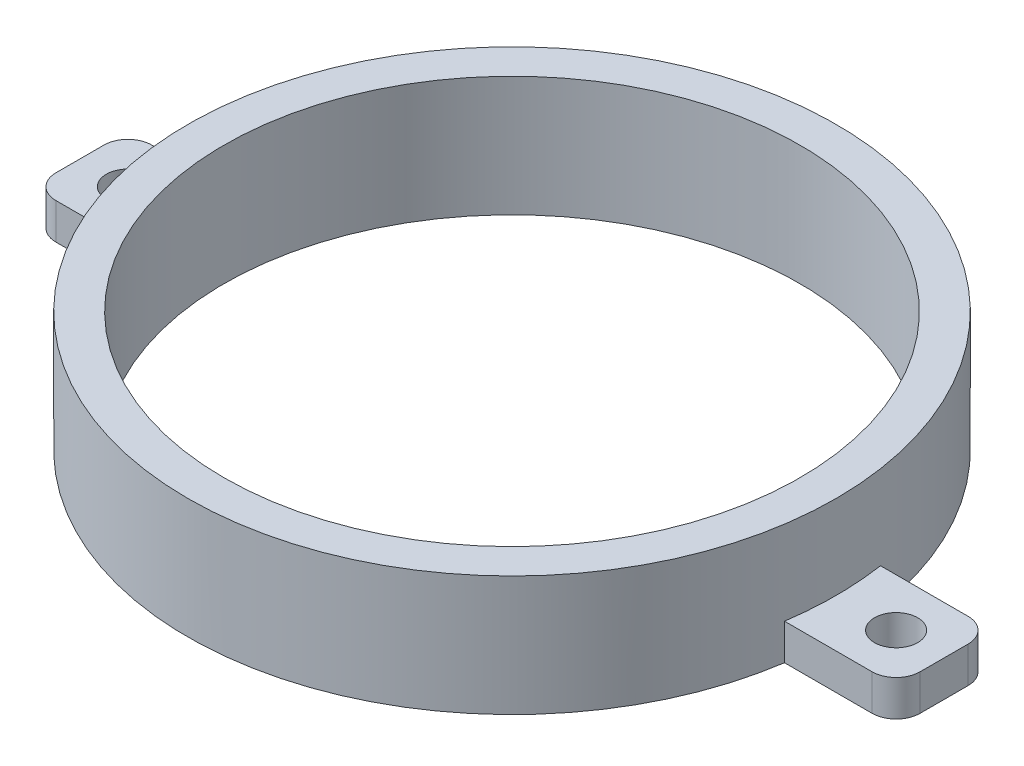
ISO-10303-21;
HEADER;
FILE_DESCRIPTION(('STEP AP214'),'2;1');
FILE_NAME('part.step','',(''),(''),'','','');
FILE_SCHEMA(('AUTOMOTIVE_DESIGN { 1 0 10303 214 1 1 1 1 }'));
ENDSEC;
DATA;
#1=APPLICATION_CONTEXT('core data for automotive mechanical design processes');
#2=APPLICATION_PROTOCOL_DEFINITION('international standard','automotive_design',2000,#1);
#3=PRODUCT_CONTEXT('',#1,'mechanical');
#4=PRODUCT('Part','Part','',(#3));
#5=PRODUCT_RELATED_PRODUCT_CATEGORY('part','',(#4));
#6=PRODUCT_DEFINITION_FORMATION('','',#4);
#7=PRODUCT_DEFINITION_CONTEXT('part definition',#1,'design');
#8=PRODUCT_DEFINITION('design','',#6,#7);
#9=PRODUCT_DEFINITION_SHAPE('','',#8);
#10=(LENGTH_UNIT() NAMED_UNIT(*) SI_UNIT(.MILLI.,.METRE.));
#11=(NAMED_UNIT(*) PLANE_ANGLE_UNIT() SI_UNIT($,.RADIAN.));
#12=(NAMED_UNIT(*) SI_UNIT($,.STERADIAN.) SOLID_ANGLE_UNIT());
#13=UNCERTAINTY_MEASURE_WITH_UNIT(LENGTH_MEASURE(1.E-05),#10,'distance_accuracy_value','');
#14=(GEOMETRIC_REPRESENTATION_CONTEXT(3) GLOBAL_UNCERTAINTY_ASSIGNED_CONTEXT((#13)) GLOBAL_UNIT_ASSIGNED_CONTEXT((#10,
#11,#12)) REPRESENTATION_CONTEXT('',''));
#15=CARTESIAN_POINT('',(0.,0.,0.));
#16=DIRECTION('',(0.,0.,1.));
#17=DIRECTION('',(1.,0.,0.));
#18=AXIS2_PLACEMENT_3D('',#15,#16,#17);
#19=CARTESIAN_POINT('',(0.,10.,0.));
#20=DIRECTION('',(0.,-1.,0.));
#21=DIRECTION('',(0.,0.,-1.));
#22=AXIS2_PLACEMENT_3D('',#19,#20,#21);
#23=CYLINDRICAL_SURFACE('',#22,27.);
#24=CARTESIAN_POINT('',(0.,0.,0.));
#25=DIRECTION('',(0.,1.,0.));
#26=DIRECTION('',(0.,0.,1.));
#27=AXIS2_PLACEMENT_3D('',#24,#25,#26);
#28=CIRCLE('',#27,27.);
#29=CARTESIAN_POINT('',(-26.7020598456374,0.,4.));
#30=VERTEX_POINT('',#29);
#31=CARTESIAN_POINT('',(26.7020598456374,0.,4.));
#32=VERTEX_POINT('',#31);
#33=EDGE_CURVE('E226',#30,#32,#28,.T.);
#34=ORIENTED_EDGE('',*,*,#33,.T.);
#35=DIRECTION('',(0.,-1.,0.));
#36=VECTOR('',#35,1.);
#37=CARTESIAN_POINT('',(26.7020598456374,10.,4.));
#38=LINE('',#37,#36);
#39=CARTESIAN_POINT('',(26.7020598456374,3.,4.));
#40=VERTEX_POINT('',#39);
#41=EDGE_CURVE('E47',#32,#40,#38,.F.);
#42=ORIENTED_EDGE('',*,*,#41,.T.);
#43=CARTESIAN_POINT('',(0.,3.,0.));
#44=DIRECTION('',(0.,-1.,0.));
#45=DIRECTION('',(0.,0.,-1.));
#46=AXIS2_PLACEMENT_3D('',#43,#44,#45);
#47=CIRCLE('',#46,27.);
#48=CARTESIAN_POINT('',(26.7020598456374,3.,-4.));
#49=VERTEX_POINT('',#48);
#50=EDGE_CURVE('E51',#49,#40,#47,.T.);
#51=ORIENTED_EDGE('',*,*,#50,.F.);
#52=DIRECTION('',(0.,-1.,0.));
#53=VECTOR('',#52,1.);
#54=CARTESIAN_POINT('',(26.7020598456374,10.,-4.));
#55=LINE('',#54,#53);
#56=CARTESIAN_POINT('',(26.7020598456374,0.,-4.));
#57=VERTEX_POINT('',#56);
#58=EDGE_CURVE('E170',#49,#57,#55,.T.);
#59=ORIENTED_EDGE('',*,*,#58,.T.);
#60=CARTESIAN_POINT('',(-26.7020598456374,0.,-4.));
#61=VERTEX_POINT('',#60);
#62=EDGE_CURVE('E220',#57,#61,#28,.T.);
#63=ORIENTED_EDGE('',*,*,#62,.T.);
#64=DIRECTION('',(0.,-1.,0.));
#65=VECTOR('',#64,1.);
#66=CARTESIAN_POINT('',(-26.7020598456374,10.,-4.));
#67=LINE('',#66,#65);
#68=CARTESIAN_POINT('',(-26.7020598456374,3.,-4.));
#69=VERTEX_POINT('',#68);
#70=EDGE_CURVE('E11',#69,#61,#67,.T.);
#71=ORIENTED_EDGE('',*,*,#70,.F.);
#72=CARTESIAN_POINT('',(0.,3.,0.));
#73=DIRECTION('',(0.,-1.,0.));
#74=DIRECTION('',(0.,0.,-1.));
#75=AXIS2_PLACEMENT_3D('',#72,#73,#74);
#76=CIRCLE('',#75,27.);
#77=CARTESIAN_POINT('',(-26.7020598456374,3.,4.));
#78=VERTEX_POINT('',#77);
#79=EDGE_CURVE('E213',#78,#69,#76,.T.);
#80=ORIENTED_EDGE('',*,*,#79,.F.);
#81=DIRECTION('',(0.,-1.,0.));
#82=VECTOR('',#81,1.);
#83=CARTESIAN_POINT('',(-26.7020598456374,10.,4.));
#84=LINE('',#83,#82);
#85=EDGE_CURVE('E40',#30,#78,#84,.F.);
#86=ORIENTED_EDGE('',*,*,#85,.F.);
#87=EDGE_LOOP('',(#34,#42,#51,#59,#63,#71,#80,#86));
#88=FACE_BOUND('',#87,.T.);
#89=CARTESIAN_POINT('',(0.,10.,0.));
#90=DIRECTION('',(0.,1.,0.));
#91=DIRECTION('',(0.,0.,1.));
#92=AXIS2_PLACEMENT_3D('',#89,#90,#91);
#93=CIRCLE('',#92,27.);
#94=CARTESIAN_POINT('',(0.,10.,27.));
#95=VERTEX_POINT('',#94);
#96=EDGE_CURVE('E223',#95,#95,#93,.T.);
#97=ORIENTED_EDGE('',*,*,#96,.F.);
#98=EDGE_LOOP('',(#97));
#99=FACE_BOUND('',#98,.T.);
#100=ADVANCED_FACE('F33',(#88,#99),#23,.T.);
#101=CARTESIAN_POINT('',(0.,10.,0.));
#102=DIRECTION('',(0.,1.,0.));
#103=DIRECTION('',(0.,0.,1.));
#104=AXIS2_PLACEMENT_3D('',#101,#102,#103);
#105=PLANE('',#104);
#106=ORIENTED_EDGE('',*,*,#96,.T.);
#107=EDGE_LOOP('',(#106));
#108=FACE_BOUND('',#107,.T.);
#109=CARTESIAN_POINT('',(0.,10.,0.));
#110=DIRECTION('',(0.,1.,0.));
#111=DIRECTION('',(0.,0.,1.));
#112=AXIS2_PLACEMENT_3D('',#109,#110,#111);
#113=CIRCLE('',#112,24.);
#114=CARTESIAN_POINT('',(0.,10.,24.));
#115=VERTEX_POINT('',#114);
#116=EDGE_CURVE('E217',#115,#115,#113,.T.);
#117=ORIENTED_EDGE('',*,*,#116,.F.);
#118=EDGE_LOOP('',(#117));
#119=FACE_BOUND('',#118,.T.);
#120=ADVANCED_FACE('F250',(#108,#119),#105,.T.);
#121=CARTESIAN_POINT('',(0.,0.,0.));
#122=DIRECTION('',(0.,1.,0.));
#123=DIRECTION('',(0.,0.,1.));
#124=AXIS2_PLACEMENT_3D('',#121,#122,#123);
#125=PLANE('',#124);
#126=ORIENTED_EDGE('',*,*,#62,.F.);
#127=DIRECTION('',(1.,0.,0.));
#128=VECTOR('',#127,1.);
#129=CARTESIAN_POINT('',(24.,0.,-4.));
#130=LINE('',#129,#128);
#131=CARTESIAN_POINT('',(34.,0.,-3.99999999999999));
#132=VERTEX_POINT('',#131);
#133=EDGE_CURVE('E139',#57,#132,#130,.T.);
#134=ORIENTED_EDGE('',*,*,#133,.T.);
#135=CARTESIAN_POINT('',(34.,0.,-2.));
#136=DIRECTION('',(0.,-1.,0.));
#137=DIRECTION('',(0.,0.,-1.));
#138=AXIS2_PLACEMENT_3D('',#135,#136,#137);
#139=CIRCLE('',#138,2.);
#140=CARTESIAN_POINT('',(36.,0.,-1.99999999999998));
#141=VERTEX_POINT('',#140);
#142=EDGE_CURVE('E160',#132,#141,#139,.T.);
#143=ORIENTED_EDGE('',*,*,#142,.T.);
#144=DIRECTION('',(0.,0.,1.));
#145=VECTOR('',#144,1.);
#146=CARTESIAN_POINT('',(36.,0.,-1.99999999999998));
#147=LINE('',#146,#145);
#148=CARTESIAN_POINT('',(36.,0.,1.99999999999999));
#149=VERTEX_POINT('',#148);
#150=EDGE_CURVE('E157',#141,#149,#147,.T.);
#151=ORIENTED_EDGE('',*,*,#150,.T.);
#152=CARTESIAN_POINT('',(34.,0.,2.));
#153=DIRECTION('',(0.,-1.,0.));
#154=DIRECTION('',(0.,0.,-1.));
#155=AXIS2_PLACEMENT_3D('',#152,#153,#154);
#156=CIRCLE('',#155,2.);
#157=CARTESIAN_POINT('',(34.,0.,4.00000000000001));
#158=VERTEX_POINT('',#157);
#159=EDGE_CURVE('E154',#149,#158,#156,.T.);
#160=ORIENTED_EDGE('',*,*,#159,.T.);
#161=DIRECTION('',(-1.,0.,0.));
#162=VECTOR('',#161,1.);
#163=CARTESIAN_POINT('',(34.,0.,4.));
#164=LINE('',#163,#162);
#165=EDGE_CURVE('E125',#158,#32,#164,.T.);
#166=ORIENTED_EDGE('',*,*,#165,.T.);
#167=ORIENTED_EDGE('',*,*,#33,.F.);
#168=DIRECTION('',(1.,0.,0.));
#169=VECTOR('',#168,1.);
#170=CARTESIAN_POINT('',(-34.,0.,4.));
#171=LINE('',#170,#169);
#172=CARTESIAN_POINT('',(-34.,0.,4.00000000000001));
#173=VERTEX_POINT('',#172);
#174=EDGE_CURVE('E183',#173,#30,#171,.T.);
#175=ORIENTED_EDGE('',*,*,#174,.F.);
#176=CARTESIAN_POINT('',(-34.,0.,2.));
#177=DIRECTION('',(0.,1.,0.));
#178=DIRECTION('',(0.,0.,-1.));
#179=AXIS2_PLACEMENT_3D('',#176,#177,#178);
#180=CIRCLE('',#179,2.);
#181=CARTESIAN_POINT('',(-36.,0.,1.99999999999999));
#182=VERTEX_POINT('',#181);
#183=EDGE_CURVE('E198',#182,#173,#180,.T.);
#184=ORIENTED_EDGE('',*,*,#183,.F.);
#185=DIRECTION('',(0.,0.,1.));
#186=VECTOR('',#185,1.);
#187=CARTESIAN_POINT('',(-36.,0.,-1.99999999999998));
#188=LINE('',#187,#186);
#189=CARTESIAN_POINT('',(-36.,0.,-1.99999999999998));
#190=VERTEX_POINT('',#189);
#191=EDGE_CURVE('E196',#190,#182,#188,.T.);
#192=ORIENTED_EDGE('',*,*,#191,.F.);
#193=CARTESIAN_POINT('',(-34.,0.,-2.));
#194=DIRECTION('',(0.,1.,0.));
#195=DIRECTION('',(0.,0.,-1.));
#196=AXIS2_PLACEMENT_3D('',#193,#194,#195);
#197=CIRCLE('',#196,2.);
#198=CARTESIAN_POINT('',(-34.,0.,-3.99999999999999));
#199=VERTEX_POINT('',#198);
#200=EDGE_CURVE('E194',#199,#190,#197,.T.);
#201=ORIENTED_EDGE('',*,*,#200,.F.);
#202=DIRECTION('',(-1.,0.,0.));
#203=VECTOR('',#202,1.);
#204=CARTESIAN_POINT('',(-24.,0.,-4.));
#205=LINE('',#204,#203);
#206=EDGE_CURVE('E177',#61,#199,#205,.T.);
#207=ORIENTED_EDGE('',*,*,#206,.F.);
#208=EDGE_LOOP('',(#126,#134,#143,#151,#160,#166,#167,#175,#184,#192,#201,#207));
#209=FACE_BOUND('',#208,.T.);
#210=CARTESIAN_POINT('',(0.,0.,0.));
#211=DIRECTION('',(0.,1.,0.));
#212=DIRECTION('',(0.,0.,1.));
#213=AXIS2_PLACEMENT_3D('',#210,#211,#212);
#214=CIRCLE('',#213,24.);
#215=CARTESIAN_POINT('',(0.,0.,24.));
#216=VERTEX_POINT('',#215);
#217=EDGE_CURVE('E216',#216,#216,#214,.T.);
#218=ORIENTED_EDGE('',*,*,#217,.T.);
#219=EDGE_LOOP('',(#218));
#220=FACE_BOUND('',#219,.T.);
#221=CARTESIAN_POINT('',(-32.,0.,0.));
#222=DIRECTION('',(0.,1.,0.));
#223=DIRECTION('',(0.,0.,1.));
#224=AXIS2_PLACEMENT_3D('',#221,#222,#223);
#225=CIRCLE('',#224,1.8);
#226=CARTESIAN_POINT('',(-32.,0.,1.8));
#227=VERTEX_POINT('',#226);
#228=EDGE_CURVE('E173',#227,#227,#225,.T.);
#229=ORIENTED_EDGE('',*,*,#228,.T.);
#230=EDGE_LOOP('',(#229));
#231=FACE_BOUND('',#230,.T.);
#232=CARTESIAN_POINT('',(32.,0.,0.));
#233=DIRECTION('',(0.,-1.,0.));
#234=DIRECTION('',(0.,0.,1.));
#235=AXIS2_PLACEMENT_3D('',#232,#233,#234);
#236=CIRCLE('',#235,1.8);
#237=CARTESIAN_POINT('',(32.,0.,1.8));
#238=VERTEX_POINT('',#237);
#239=EDGE_CURVE('E318',#238,#238,#236,.T.);
#240=ORIENTED_EDGE('',*,*,#239,.F.);
#241=EDGE_LOOP('',(#240));
#242=FACE_BOUND('',#241,.T.);
#243=ADVANCED_FACE('F245',(#209,#220,#231,#242),#125,.F.);
#244=CARTESIAN_POINT('',(0.,10.,0.));
#245=DIRECTION('',(0.,-1.,0.));
#246=DIRECTION('',(0.,0.,-1.));
#247=AXIS2_PLACEMENT_3D('',#244,#245,#246);
#248=CYLINDRICAL_SURFACE('',#247,24.);
#249=ORIENTED_EDGE('',*,*,#217,.F.);
#250=EDGE_LOOP('',(#249));
#251=FACE_BOUND('',#250,.T.);
#252=ORIENTED_EDGE('',*,*,#116,.T.);
#253=EDGE_LOOP('',(#252));
#254=FACE_BOUND('',#253,.T.);
#255=ADVANCED_FACE('F258',(#251,#254),#248,.F.);
#256=CARTESIAN_POINT('',(-24.,3.,-4.));
#257=DIRECTION('',(0.,0.,1.));
#258=DIRECTION('',(1.,0.,0.));
#259=AXIS2_PLACEMENT_3D('',#256,#257,#258);
#260=PLANE('',#259);
#261=DIRECTION('',(-1.,0.,0.));
#262=VECTOR('',#261,1.);
#263=CARTESIAN_POINT('',(-24.,3.,-4.));
#264=LINE('',#263,#262);
#265=CARTESIAN_POINT('',(-34.,3.,-3.99999999999999));
#266=VERTEX_POINT('',#265);
#267=EDGE_CURVE('E180',#69,#266,#264,.T.);
#268=ORIENTED_EDGE('',*,*,#267,.F.);
#269=ORIENTED_EDGE('',*,*,#70,.T.);
#270=ORIENTED_EDGE('',*,*,#206,.T.);
#271=DIRECTION('',(0.,-1.,0.));
#272=VECTOR('',#271,1.);
#273=CARTESIAN_POINT('',(-34.,3.,-3.99999999999999));
#274=LINE('',#273,#272);
#275=EDGE_CURVE('E210',#266,#199,#274,.T.);
#276=ORIENTED_EDGE('',*,*,#275,.F.);
#277=EDGE_LOOP('',(#268,#269,#270,#276));
#278=FACE_BOUND('',#277,.T.);
#279=ADVANCED_FACE('F260',(#278),#260,.F.);
#280=CARTESIAN_POINT('',(-34.,3.,4.));
#281=DIRECTION('',(0.,0.,-1.));
#282=DIRECTION('',(-1.,0.,0.));
#283=AXIS2_PLACEMENT_3D('',#280,#281,#282);
#284=PLANE('',#283);
#285=ORIENTED_EDGE('',*,*,#174,.T.);
#286=ORIENTED_EDGE('',*,*,#85,.T.);
#287=DIRECTION('',(1.,0.,0.));
#288=VECTOR('',#287,1.);
#289=CARTESIAN_POINT('',(-34.,3.,4.));
#290=LINE('',#289,#288);
#291=CARTESIAN_POINT('',(-34.,3.,4.00000000000001));
#292=VERTEX_POINT('',#291);
#293=EDGE_CURVE('E189',#292,#78,#290,.T.);
#294=ORIENTED_EDGE('',*,*,#293,.F.);
#295=DIRECTION('',(0.,-1.,0.));
#296=VECTOR('',#295,1.);
#297=CARTESIAN_POINT('',(-34.,3.,4.00000000000001));
#298=LINE('',#297,#296);
#299=EDGE_CURVE('E192',#292,#173,#298,.T.);
#300=ORIENTED_EDGE('',*,*,#299,.T.);
#301=EDGE_LOOP('',(#285,#286,#294,#300));
#302=FACE_BOUND('',#301,.T.);
#303=ADVANCED_FACE('F230',(#302),#284,.F.);
#304=CARTESIAN_POINT('',(-34.,3.,-2.));
#305=DIRECTION('',(0.,-1.,0.));
#306=DIRECTION('',(0.,0.,-1.));
#307=AXIS2_PLACEMENT_3D('',#304,#305,#306);
#308=PLANE('',#307);
#309=ORIENTED_EDGE('',*,*,#293,.T.);
#310=ORIENTED_EDGE('',*,*,#79,.T.);
#311=ORIENTED_EDGE('',*,*,#267,.T.);
#312=CARTESIAN_POINT('',(-34.,3.,-2.));
#313=DIRECTION('',(0.,1.,0.));
#314=DIRECTION('',(0.,0.,-1.));
#315=AXIS2_PLACEMENT_3D('',#312,#313,#314);
#316=CIRCLE('',#315,2.);
#317=CARTESIAN_POINT('',(-36.,3.,-1.99999999999998));
#318=VERTEX_POINT('',#317);
#319=EDGE_CURVE('E182',#266,#318,#316,.T.);
#320=ORIENTED_EDGE('',*,*,#319,.T.);
#321=DIRECTION('',(0.,0.,1.));
#322=VECTOR('',#321,1.);
#323=CARTESIAN_POINT('',(-36.,3.,-1.99999999999998));
#324=LINE('',#323,#322);
#325=CARTESIAN_POINT('',(-36.,3.,1.99999999999999));
#326=VERTEX_POINT('',#325);
#327=EDGE_CURVE('E185',#318,#326,#324,.T.);
#328=ORIENTED_EDGE('',*,*,#327,.T.);
#329=CARTESIAN_POINT('',(-34.,3.,2.));
#330=DIRECTION('',(0.,1.,0.));
#331=DIRECTION('',(0.,0.,-1.));
#332=AXIS2_PLACEMENT_3D('',#329,#330,#331);
#333=CIRCLE('',#332,2.);
#334=EDGE_CURVE('E187',#326,#292,#333,.T.);
#335=ORIENTED_EDGE('',*,*,#334,.T.);
#336=EDGE_LOOP('',(#309,#310,#311,#320,#328,#335));
#337=FACE_BOUND('',#336,.T.);
#338=CARTESIAN_POINT('',(-32.,3.,0.));
#339=DIRECTION('',(0.,1.,0.));
#340=DIRECTION('',(0.,0.,1.));
#341=AXIS2_PLACEMENT_3D('',#338,#339,#340);
#342=CIRCLE('',#341,1.8);
#343=CARTESIAN_POINT('',(-32.,3.,1.8));
#344=VERTEX_POINT('',#343);
#345=EDGE_CURVE('E174',#344,#344,#342,.T.);
#346=ORIENTED_EDGE('',*,*,#345,.F.);
#347=EDGE_LOOP('',(#346));
#348=FACE_BOUND('',#347,.T.);
#349=ADVANCED_FACE('F234',(#337,#348),#308,.F.);
#350=CARTESIAN_POINT('',(-34.,3.,-2.));
#351=DIRECTION('',(0.,-1.,0.));
#352=DIRECTION('',(0.,0.,-1.));
#353=AXIS2_PLACEMENT_3D('',#350,#351,#352);
#354=CYLINDRICAL_SURFACE('',#353,2.);
#355=ORIENTED_EDGE('',*,*,#200,.T.);
#356=DIRECTION('',(0.,-1.,0.));
#357=VECTOR('',#356,1.);
#358=CARTESIAN_POINT('',(-36.,3.,-1.99999999999998));
#359=LINE('',#358,#357);
#360=EDGE_CURVE('E207',#318,#190,#359,.T.);
#361=ORIENTED_EDGE('',*,*,#360,.F.);
#362=ORIENTED_EDGE('',*,*,#319,.F.);
#363=ORIENTED_EDGE('',*,*,#275,.T.);
#364=EDGE_LOOP('',(#355,#361,#362,#363));
#365=FACE_BOUND('',#364,.T.);
#366=ADVANCED_FACE('F271',(#365),#354,.T.);
#367=CARTESIAN_POINT('',(-36.,3.,-1.99999999999998));
#368=DIRECTION('',(1.,0.,0.));
#369=DIRECTION('',(0.,0.,-1.));
#370=AXIS2_PLACEMENT_3D('',#367,#368,#369);
#371=PLANE('',#370);
#372=ORIENTED_EDGE('',*,*,#191,.T.);
#373=DIRECTION('',(0.,-1.,0.));
#374=VECTOR('',#373,1.);
#375=CARTESIAN_POINT('',(-36.,3.,1.99999999999999));
#376=LINE('',#375,#374);
#377=EDGE_CURVE('E204',#326,#182,#376,.T.);
#378=ORIENTED_EDGE('',*,*,#377,.F.);
#379=ORIENTED_EDGE('',*,*,#327,.F.);
#380=ORIENTED_EDGE('',*,*,#360,.T.);
#381=EDGE_LOOP('',(#372,#378,#379,#380));
#382=FACE_BOUND('',#381,.T.);
#383=ADVANCED_FACE('F274',(#382),#371,.F.);
#384=CARTESIAN_POINT('',(-34.,3.,2.));
#385=DIRECTION('',(0.,-1.,0.));
#386=DIRECTION('',(0.,0.,-1.));
#387=AXIS2_PLACEMENT_3D('',#384,#385,#386);
#388=CYLINDRICAL_SURFACE('',#387,2.);
#389=ORIENTED_EDGE('',*,*,#183,.T.);
#390=ORIENTED_EDGE('',*,*,#299,.F.);
#391=ORIENTED_EDGE('',*,*,#334,.F.);
#392=ORIENTED_EDGE('',*,*,#377,.T.);
#393=EDGE_LOOP('',(#389,#390,#391,#392));
#394=FACE_BOUND('',#393,.T.);
#395=ADVANCED_FACE('F242',(#394),#388,.T.);
#396=CARTESIAN_POINT('',(-32.,3.,0.));
#397=DIRECTION('',(0.,-1.,0.));
#398=DIRECTION('',(0.,0.,-1.));
#399=AXIS2_PLACEMENT_3D('',#396,#397,#398);
#400=CYLINDRICAL_SURFACE('',#399,1.8);
#401=ORIENTED_EDGE('',*,*,#345,.T.);
#402=EDGE_LOOP('',(#401));
#403=FACE_BOUND('',#402,.T.);
#404=ORIENTED_EDGE('',*,*,#228,.F.);
#405=EDGE_LOOP('',(#404));
#406=FACE_BOUND('',#405,.T.);
#407=ADVANCED_FACE('F281',(#403,#406),#400,.F.);
#408=CARTESIAN_POINT('',(34.,3.,4.));
#409=DIRECTION('',(0.,0.,1.));
#410=DIRECTION('',(1.,0.,0.));
#411=AXIS2_PLACEMENT_3D('',#408,#409,#410);
#412=PLANE('',#411);
#413=ORIENTED_EDGE('',*,*,#41,.F.);
#414=ORIENTED_EDGE('',*,*,#165,.F.);
#415=DIRECTION('',(0.,-1.,0.));
#416=VECTOR('',#415,1.);
#417=CARTESIAN_POINT('',(34.,3.,4.00000000000001));
#418=LINE('',#417,#416);
#419=CARTESIAN_POINT('',(34.,3.,4.00000000000001));
#420=VERTEX_POINT('',#419);
#421=EDGE_CURVE('E120',#420,#158,#418,.T.);
#422=ORIENTED_EDGE('',*,*,#421,.F.);
#423=DIRECTION('',(-1.,0.,0.));
#424=VECTOR('',#423,1.);
#425=CARTESIAN_POINT('',(34.,3.,4.));
#426=LINE('',#425,#424);
#427=EDGE_CURVE('E123',#420,#40,#426,.T.);
#428=ORIENTED_EDGE('',*,*,#427,.T.);
#429=EDGE_LOOP('',(#413,#414,#422,#428));
#430=FACE_BOUND('',#429,.T.);
#431=ADVANCED_FACE('F122',(#430),#412,.T.);
#432=CARTESIAN_POINT('',(24.,3.,-4.));
#433=DIRECTION('',(0.,0.,-1.));
#434=DIRECTION('',(-1.,0.,0.));
#435=AXIS2_PLACEMENT_3D('',#432,#433,#434);
#436=PLANE('',#435);
#437=ORIENTED_EDGE('',*,*,#58,.F.);
#438=DIRECTION('',(1.,0.,0.));
#439=VECTOR('',#438,1.);
#440=CARTESIAN_POINT('',(24.,3.,-4.));
#441=LINE('',#440,#439);
#442=CARTESIAN_POINT('',(34.,3.,-3.99999999999999));
#443=VERTEX_POINT('',#442);
#444=EDGE_CURVE('E150',#49,#443,#441,.T.);
#445=ORIENTED_EDGE('',*,*,#444,.T.);
#446=DIRECTION('',(0.,-1.,0.));
#447=VECTOR('',#446,1.);
#448=CARTESIAN_POINT('',(34.,3.,-3.99999999999999));
#449=LINE('',#448,#447);
#450=EDGE_CURVE('E152',#443,#132,#449,.T.);
#451=ORIENTED_EDGE('',*,*,#450,.T.);
#452=ORIENTED_EDGE('',*,*,#133,.F.);
#453=EDGE_LOOP('',(#437,#445,#451,#452));
#454=FACE_BOUND('',#453,.T.);
#455=ADVANCED_FACE('F291',(#454),#436,.T.);
#456=CARTESIAN_POINT('',(34.,3.,2.));
#457=DIRECTION('',(0.,-1.,0.));
#458=DIRECTION('',(0.,0.,-1.));
#459=AXIS2_PLACEMENT_3D('',#456,#457,#458);
#460=CYLINDRICAL_SURFACE('',#459,2.);
#461=ORIENTED_EDGE('',*,*,#159,.F.);
#462=DIRECTION('',(0.,-1.,0.));
#463=VECTOR('',#462,1.);
#464=CARTESIAN_POINT('',(36.,3.,1.99999999999999));
#465=LINE('',#464,#463);
#466=CARTESIAN_POINT('',(36.,3.,1.99999999999999));
#467=VERTEX_POINT('',#466);
#468=EDGE_CURVE('E130',#467,#149,#465,.T.);
#469=ORIENTED_EDGE('',*,*,#468,.F.);
#470=CARTESIAN_POINT('',(34.,3.,2.));
#471=DIRECTION('',(0.,-1.,0.));
#472=DIRECTION('',(0.,0.,-1.));
#473=AXIS2_PLACEMENT_3D('',#470,#471,#472);
#474=CIRCLE('',#473,2.);
#475=EDGE_CURVE('E137',#467,#420,#474,.T.);
#476=ORIENTED_EDGE('',*,*,#475,.T.);
#477=ORIENTED_EDGE('',*,*,#421,.T.);
#478=EDGE_LOOP('',(#461,#469,#476,#477));
#479=FACE_BOUND('',#478,.T.);
#480=ADVANCED_FACE('F141',(#479),#460,.T.);
#481=CARTESIAN_POINT('',(36.,3.,-1.99999999999998));
#482=DIRECTION('',(1.,0.,0.));
#483=DIRECTION('',(0.,0.,-1.));
#484=AXIS2_PLACEMENT_3D('',#481,#482,#483);
#485=PLANE('',#484);
#486=ORIENTED_EDGE('',*,*,#150,.F.);
#487=DIRECTION('',(0.,-1.,0.));
#488=VECTOR('',#487,1.);
#489=CARTESIAN_POINT('',(36.,3.,-1.99999999999998));
#490=LINE('',#489,#488);
#491=CARTESIAN_POINT('',(36.,3.,-1.99999999999998));
#492=VERTEX_POINT('',#491);
#493=EDGE_CURVE('E166',#492,#141,#490,.T.);
#494=ORIENTED_EDGE('',*,*,#493,.F.);
#495=DIRECTION('',(0.,0.,1.));
#496=VECTOR('',#495,1.);
#497=CARTESIAN_POINT('',(36.,3.,-1.99999999999998));
#498=LINE('',#497,#496);
#499=EDGE_CURVE('E142',#492,#467,#498,.T.);
#500=ORIENTED_EDGE('',*,*,#499,.T.);
#501=ORIENTED_EDGE('',*,*,#468,.T.);
#502=EDGE_LOOP('',(#486,#494,#500,#501));
#503=FACE_BOUND('',#502,.T.);
#504=ADVANCED_FACE('F294',(#503),#485,.T.);
#505=CARTESIAN_POINT('',(34.,3.,-2.));
#506=DIRECTION('',(0.,-1.,0.));
#507=DIRECTION('',(0.,0.,-1.));
#508=AXIS2_PLACEMENT_3D('',#505,#506,#507);
#509=CYLINDRICAL_SURFACE('',#508,2.);
#510=ORIENTED_EDGE('',*,*,#142,.F.);
#511=ORIENTED_EDGE('',*,*,#450,.F.);
#512=CARTESIAN_POINT('',(34.,3.,-2.));
#513=DIRECTION('',(0.,-1.,0.));
#514=DIRECTION('',(0.,0.,-1.));
#515=AXIS2_PLACEMENT_3D('',#512,#513,#514);
#516=CIRCLE('',#515,2.);
#517=EDGE_CURVE('E144',#443,#492,#516,.T.);
#518=ORIENTED_EDGE('',*,*,#517,.T.);
#519=ORIENTED_EDGE('',*,*,#493,.T.);
#520=EDGE_LOOP('',(#510,#511,#518,#519));
#521=FACE_BOUND('',#520,.T.);
#522=ADVANCED_FACE('F297',(#521),#509,.T.);
#523=CARTESIAN_POINT('',(34.,3.,-2.));
#524=DIRECTION('',(0.,-1.,0.));
#525=DIRECTION('',(0.,0.,-1.));
#526=AXIS2_PLACEMENT_3D('',#523,#524,#525);
#527=PLANE('',#526);
#528=CARTESIAN_POINT('',(32.,3.,0.));
#529=DIRECTION('',(0.,-1.,0.));
#530=DIRECTION('',(0.,0.,1.));
#531=AXIS2_PLACEMENT_3D('',#528,#529,#530);
#532=CIRCLE('',#531,1.8);
#533=CARTESIAN_POINT('',(32.,3.,1.8));
#534=VERTEX_POINT('',#533);
#535=EDGE_CURVE('E155',#534,#534,#532,.T.);
#536=ORIENTED_EDGE('',*,*,#535,.T.);
#537=EDGE_LOOP('',(#536));
#538=FACE_BOUND('',#537,.T.);
#539=ORIENTED_EDGE('',*,*,#444,.F.);
#540=ORIENTED_EDGE('',*,*,#50,.T.);
#541=ORIENTED_EDGE('',*,*,#427,.F.);
#542=ORIENTED_EDGE('',*,*,#475,.F.);
#543=ORIENTED_EDGE('',*,*,#499,.F.);
#544=ORIENTED_EDGE('',*,*,#517,.F.);
#545=EDGE_LOOP('',(#539,#540,#541,#542,#543,#544));
#546=FACE_BOUND('',#545,.T.);
#547=ADVANCED_FACE('F135',(#538,#546),#527,.F.);
#548=CARTESIAN_POINT('',(32.,3.,0.));
#549=DIRECTION('',(0.,-1.,0.));
#550=DIRECTION('',(0.,0.,-1.));
#551=AXIS2_PLACEMENT_3D('',#548,#549,#550);
#552=CYLINDRICAL_SURFACE('',#551,1.8);
#553=ORIENTED_EDGE('',*,*,#535,.F.);
#554=EDGE_LOOP('',(#553));
#555=FACE_BOUND('',#554,.T.);
#556=ORIENTED_EDGE('',*,*,#239,.T.);
#557=EDGE_LOOP('',(#556));
#558=FACE_BOUND('',#557,.T.);
#559=ADVANCED_FACE('F307',(#555,#558),#552,.F.);
#560=CLOSED_SHELL('',(#100,#120,#243,#255,#279,#303,#349,#366,#383,#395,#407,#431,#455,#480,
#504,#522,#547,#559));
#561=MANIFOLD_SOLID_BREP('B2',#560);
#562=ADVANCED_BREP_SHAPE_REPRESENTATION('',(#18,#561),#14);
#563=SHAPE_DEFINITION_REPRESENTATION(#9,#562);
ENDSEC;
END-ISO-10303-21;
